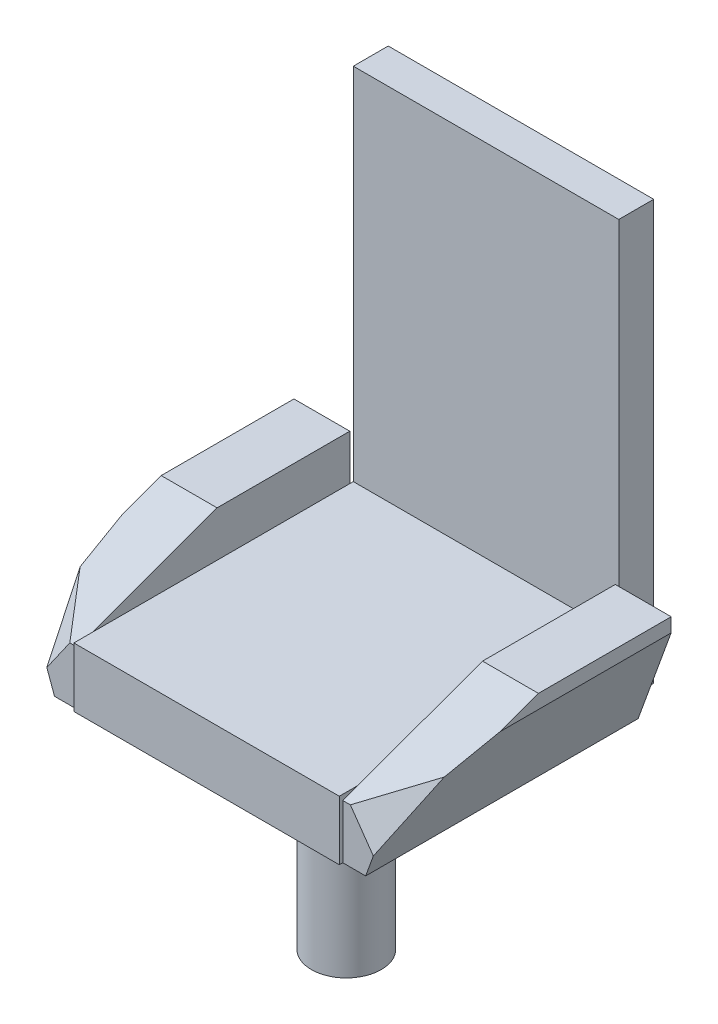
ISO-10303-21;
HEADER;
FILE_DESCRIPTION(('STEP AP214'),'2;1');
FILE_NAME('part.step','',(''),(''),'','','');
FILE_SCHEMA(('AUTOMOTIVE_DESIGN { 1 0 10303 214 1 1 1 1 }'));
ENDSEC;
DATA;
#1=APPLICATION_CONTEXT('core data for automotive mechanical design processes');
#2=APPLICATION_PROTOCOL_DEFINITION('international standard','automotive_design',2000,#1);
#3=PRODUCT_CONTEXT('',#1,'mechanical');
#4=PRODUCT('Part','Part','',(#3));
#5=PRODUCT_RELATED_PRODUCT_CATEGORY('part','',(#4));
#6=PRODUCT_DEFINITION_FORMATION('','',#4);
#7=PRODUCT_DEFINITION_CONTEXT('part definition',#1,'design');
#8=PRODUCT_DEFINITION('design','',#6,#7);
#9=PRODUCT_DEFINITION_SHAPE('','',#8);
#10=(LENGTH_UNIT() NAMED_UNIT(*) SI_UNIT(.MILLI.,.METRE.));
#11=(NAMED_UNIT(*) PLANE_ANGLE_UNIT() SI_UNIT($,.RADIAN.));
#12=(NAMED_UNIT(*) SI_UNIT($,.STERADIAN.) SOLID_ANGLE_UNIT());
#13=UNCERTAINTY_MEASURE_WITH_UNIT(LENGTH_MEASURE(1.E-05),#10,'distance_accuracy_value','');
#14=(GEOMETRIC_REPRESENTATION_CONTEXT(3) GLOBAL_UNCERTAINTY_ASSIGNED_CONTEXT((#13)) GLOBAL_UNIT_ASSIGNED_CONTEXT((#10,
#11,#12)) REPRESENTATION_CONTEXT('',''));
#15=CARTESIAN_POINT('',(0.,0.,0.));
#16=DIRECTION('',(0.,0.,1.));
#17=DIRECTION('',(1.,0.,0.));
#18=AXIS2_PLACEMENT_3D('',#15,#16,#17);
#19=CARTESIAN_POINT('',(0.,150.,195.));
#20=DIRECTION('',(0.,0.,-1.));
#21=DIRECTION('',(-1.,0.,0.));
#22=AXIS2_PLACEMENT_3D('',#19,#20,#21);
#23=PLANE('',#22);
#24=DIRECTION('',(-1.,0.,0.));
#25=VECTOR('',#24,1.);
#26=CARTESIAN_POINT('',(-270.,77.2059531467595,195.));
#27=LINE('',#26,#25);
#28=CARTESIAN_POINT('',(-190.,77.2059531467595,195.));
#29=VERTEX_POINT('',#28);
#30=CARTESIAN_POINT('',(-200.784538398965,77.2059531467595,195.));
#31=VERTEX_POINT('',#30);
#32=EDGE_CURVE('E196',#29,#31,#27,.T.);
#33=ORIENTED_EDGE('',*,*,#32,.T.);
#34=DIRECTION('',(-0.573576436351047,-0.819152044288991,0.));
#35=VECTOR('',#34,1.);
#36=CARTESIAN_POINT('',(-100.526433167311,220.389366293086,195.));
#37=LINE('',#36,#35);
#38=CARTESIAN_POINT('',(-233.683531232682,30.221322107464,195.));
#39=VERTEX_POINT('',#38);
#40=EDGE_CURVE('E194',#31,#39,#37,.T.);
#41=ORIENTED_EDGE('',*,*,#40,.T.);
#42=DIRECTION('',(-0.342020143325666,0.939692620785909,0.));
#43=VECTOR('',#42,1.);
#44=CARTESIAN_POINT('',(-222.683869545394,0.,195.));
#45=LINE('',#44,#43);
#46=CARTESIAN_POINT('',(-222.683869545394,0.,195.));
#47=VERTEX_POINT('',#46);
#48=EDGE_CURVE('E184',#39,#47,#45,.F.);
#49=ORIENTED_EDGE('',*,*,#48,.T.);
#50=DIRECTION('',(1.,0.,0.));
#51=VECTOR('',#50,1.);
#52=CARTESIAN_POINT('',(0.,0.,195.));
#53=LINE('',#52,#51);
#54=CARTESIAN_POINT('',(-190.,0.,195.));
#55=VERTEX_POINT('',#54);
#56=EDGE_CURVE('E295',#47,#55,#53,.T.);
#57=ORIENTED_EDGE('',*,*,#56,.T.);
#58=DIRECTION('',(0.,-1.,0.));
#59=VECTOR('',#58,1.);
#60=CARTESIAN_POINT('',(-190.,150.,195.));
#61=LINE('',#60,#59);
#62=EDGE_CURVE('E254',#29,#55,#61,.T.);
#63=ORIENTED_EDGE('',*,*,#62,.F.);
#64=EDGE_LOOP('',(#33,#41,#49,#57,#63));
#65=FACE_BOUND('',#64,.T.);
#66=ADVANCED_FACE('F37',(#65),#23,.F.);
#67=CARTESIAN_POINT('',(0.,150.,195.));
#68=DIRECTION('',(0.,0.,-1.));
#69=DIRECTION('',(-1.,0.,0.));
#70=AXIS2_PLACEMENT_3D('',#67,#68,#69);
#71=PLANE('',#70);
#72=DIRECTION('',(0.342020143325666,0.939692620785909,0.));
#73=VECTOR('',#72,1.);
#74=CARTESIAN_POINT('',(270.,130.000000000001,195.));
#75=LINE('',#74,#73);
#76=CARTESIAN_POINT('',(222.683869545394,0.,195.));
#77=VERTEX_POINT('',#76);
#78=CARTESIAN_POINT('',(233.683531232682,30.2213221074639,195.));
#79=VERTEX_POINT('',#78);
#80=EDGE_CURVE('E215',#77,#79,#75,.T.);
#81=ORIENTED_EDGE('',*,*,#80,.T.);
#82=DIRECTION('',(-0.573576436351047,0.819152044288991,0.));
#83=VECTOR('',#82,1.);
#84=CARTESIAN_POINT('',(100.526433167311,220.389366293086,195.));
#85=LINE('',#84,#83);
#86=CARTESIAN_POINT('',(200.784538398965,77.2059531467595,195.));
#87=VERTEX_POINT('',#86);
#88=EDGE_CURVE('E190',#79,#87,#85,.T.);
#89=ORIENTED_EDGE('',*,*,#88,.T.);
#90=DIRECTION('',(-1.,0.,0.));
#91=VECTOR('',#90,1.);
#92=CARTESIAN_POINT('',(190.,77.2059531467595,195.));
#93=LINE('',#92,#91);
#94=CARTESIAN_POINT('',(190.,77.2059531467595,195.));
#95=VERTEX_POINT('',#94);
#96=EDGE_CURVE('E233',#87,#95,#93,.T.);
#97=ORIENTED_EDGE('',*,*,#96,.T.);
#98=DIRECTION('',(0.,-1.,0.));
#99=VECTOR('',#98,1.);
#100=CARTESIAN_POINT('',(190.,150.,195.));
#101=LINE('',#100,#99);
#102=CARTESIAN_POINT('',(190.,0.,195.));
#103=VERTEX_POINT('',#102);
#104=EDGE_CURVE('E250',#95,#103,#101,.T.);
#105=ORIENTED_EDGE('',*,*,#104,.T.);
#106=DIRECTION('',(1.,0.,0.));
#107=VECTOR('',#106,1.);
#108=CARTESIAN_POINT('',(0.,0.,195.));
#109=LINE('',#108,#107);
#110=EDGE_CURVE('E315',#103,#77,#109,.T.);
#111=ORIENTED_EDGE('',*,*,#110,.T.);
#112=EDGE_LOOP('',(#81,#89,#97,#105,#111));
#113=FACE_BOUND('',#112,.T.);
#114=ADVANCED_FACE('F383',(#113),#71,.F.);
#115=CARTESIAN_POINT('',(190.,85.,200.));
#116=DIRECTION('',(-1.,0.,0.));
#117=DIRECTION('',(0.,0.,1.));
#118=AXIS2_PLACEMENT_3D('',#115,#116,#117);
#119=PLANE('',#118);
#120=ORIENTED_EDGE('',*,*,#104,.F.);
#121=DIRECTION('',(0.,0.342020143325666,-0.93969262078591));
#122=VECTOR('',#121,1.);
#123=CARTESIAN_POINT('',(190.,76.5107144084965,196.910152734508));
#124=LINE('',#123,#122);
#125=CARTESIAN_POINT('',(190.,85.,173.58603226455));
#126=VERTEX_POINT('',#125);
#127=EDGE_CURVE('E226',#95,#126,#124,.T.);
#128=ORIENTED_EDGE('',*,*,#127,.T.);
#129=DIRECTION('',(0.,0.,-1.));
#130=VECTOR('',#129,1.);
#131=CARTESIAN_POINT('',(190.,85.,200.));
#132=LINE('',#131,#130);
#133=CARTESIAN_POINT('',(190.,85.,200.));
#134=VERTEX_POINT('',#133);
#135=EDGE_CURVE('E279',#134,#126,#132,.T.);
#136=ORIENTED_EDGE('',*,*,#135,.F.);
#137=DIRECTION('',(0.,-1.,0.));
#138=VECTOR('',#137,1.);
#139=CARTESIAN_POINT('',(190.,85.,200.));
#140=LINE('',#139,#138);
#141=CARTESIAN_POINT('',(190.,0.,200.));
#142=VERTEX_POINT('',#141);
#143=EDGE_CURVE('E255',#134,#142,#140,.T.);
#144=ORIENTED_EDGE('',*,*,#143,.T.);
#145=DIRECTION('',(0.,0.,-1.));
#146=VECTOR('',#145,1.);
#147=CARTESIAN_POINT('',(190.,0.,200.));
#148=LINE('',#147,#146);
#149=EDGE_CURVE('E266',#142,#103,#148,.T.);
#150=ORIENTED_EDGE('',*,*,#149,.T.);
#151=EDGE_LOOP('',(#120,#128,#136,#144,#150));
#152=FACE_BOUND('',#151,.T.);
#153=ADVANCED_FACE('F394',(#152),#119,.F.);
#154=CARTESIAN_POINT('',(-190.,85.,200.));
#155=DIRECTION('',(1.,0.,0.));
#156=DIRECTION('',(0.,0.,-1.));
#157=AXIS2_PLACEMENT_3D('',#154,#155,#156);
#158=PLANE('',#157);
#159=DIRECTION('',(0.,-1.,0.));
#160=VECTOR('',#159,1.);
#161=CARTESIAN_POINT('',(-190.,150.,-195.));
#162=LINE('',#161,#160);
#163=CARTESIAN_POINT('',(-190.,85.,-195.));
#164=VERTEX_POINT('',#163);
#165=CARTESIAN_POINT('',(-190.,0.,-195.));
#166=VERTEX_POINT('',#165);
#167=EDGE_CURVE('E284',#164,#166,#162,.T.);
#168=ORIENTED_EDGE('',*,*,#167,.F.);
#169=DIRECTION('',(0.,0.,1.));
#170=VECTOR('',#169,1.);
#171=CARTESIAN_POINT('',(-190.,85.,200.));
#172=LINE('',#171,#170);
#173=CARTESIAN_POINT('',(-190.,85.,-200.));
#174=VERTEX_POINT('',#173);
#175=EDGE_CURVE('E271',#174,#164,#172,.T.);
#176=ORIENTED_EDGE('',*,*,#175,.F.);
#177=DIRECTION('',(0.,1.,0.));
#178=VECTOR('',#177,1.);
#179=CARTESIAN_POINT('',(-190.,0.,-200.));
#180=LINE('',#179,#178);
#181=CARTESIAN_POINT('',(-190.,600.,-200.));
#182=VERTEX_POINT('',#181);
#183=EDGE_CURVE('E337',#174,#182,#180,.T.);
#184=ORIENTED_EDGE('',*,*,#183,.T.);
#185=DIRECTION('',(0.,0.,1.));
#186=VECTOR('',#185,1.);
#187=CARTESIAN_POINT('',(-190.,600.,-250.));
#188=LINE('',#187,#186);
#189=CARTESIAN_POINT('',(-190.,600.,-250.));
#190=VERTEX_POINT('',#189);
#191=EDGE_CURVE('E318',#190,#182,#188,.T.);
#192=ORIENTED_EDGE('',*,*,#191,.F.);
#193=DIRECTION('',(0.,1.,0.));
#194=VECTOR('',#193,1.);
#195=CARTESIAN_POINT('',(-190.,0.,-250.));
#196=LINE('',#195,#194);
#197=CARTESIAN_POINT('',(-190.,0.,-250.));
#198=VERTEX_POINT('',#197);
#199=EDGE_CURVE('E334',#198,#190,#196,.T.);
#200=ORIENTED_EDGE('',*,*,#199,.F.);
#201=DIRECTION('',(0.,0.,1.));
#202=VECTOR('',#201,1.);
#203=CARTESIAN_POINT('',(-190.,0.,200.));
#204=LINE('',#203,#202);
#205=EDGE_CURVE('E262',#198,#166,#204,.T.);
#206=ORIENTED_EDGE('',*,*,#205,.T.);
#207=EDGE_LOOP('',(#168,#176,#184,#192,#200,#206));
#208=FACE_BOUND('',#207,.T.);
#209=ADVANCED_FACE('F431',(#208),#158,.F.);
#210=CARTESIAN_POINT('',(190.,85.,-195.));
#211=VERTEX_POINT('',#210);
#212=CARTESIAN_POINT('',(190.,85.,-200.));
#213=VERTEX_POINT('',#212);
#214=EDGE_CURVE('E261',#211,#213,#132,.T.);
#215=ORIENTED_EDGE('',*,*,#214,.F.);
#216=DIRECTION('',(0.,-1.,0.));
#217=VECTOR('',#216,1.);
#218=CARTESIAN_POINT('',(190.,150.,-195.));
#219=LINE('',#218,#217);
#220=CARTESIAN_POINT('',(190.,0.,-195.));
#221=VERTEX_POINT('',#220);
#222=EDGE_CURVE('E304',#211,#221,#219,.T.);
#223=ORIENTED_EDGE('',*,*,#222,.T.);
#224=CARTESIAN_POINT('',(190.,0.,-250.));
#225=VERTEX_POINT('',#224);
#226=EDGE_CURVE('E269',#221,#225,#148,.T.);
#227=ORIENTED_EDGE('',*,*,#226,.T.);
#228=DIRECTION('',(0.,-1.,0.));
#229=VECTOR('',#228,1.);
#230=CARTESIAN_POINT('',(190.,0.,-250.));
#231=LINE('',#230,#229);
#232=CARTESIAN_POINT('',(190.,600.,-250.));
#233=VERTEX_POINT('',#232);
#234=EDGE_CURVE('E342',#233,#225,#231,.T.);
#235=ORIENTED_EDGE('',*,*,#234,.F.);
#236=DIRECTION('',(0.,0.,1.));
#237=VECTOR('',#236,1.);
#238=CARTESIAN_POINT('',(190.,600.,-250.));
#239=LINE('',#238,#237);
#240=CARTESIAN_POINT('',(190.,600.,-200.));
#241=VERTEX_POINT('',#240);
#242=EDGE_CURVE('E327',#233,#241,#239,.T.);
#243=ORIENTED_EDGE('',*,*,#242,.T.);
#244=DIRECTION('',(0.,-1.,0.));
#245=VECTOR('',#244,1.);
#246=CARTESIAN_POINT('',(190.,0.,-200.));
#247=LINE('',#246,#245);
#248=EDGE_CURVE('E331',#241,#213,#247,.T.);
#249=ORIENTED_EDGE('',*,*,#248,.T.);
#250=EDGE_LOOP('',(#215,#223,#227,#235,#243,#249));
#251=FACE_BOUND('',#250,.T.);
#252=ADVANCED_FACE('F439',(#251),#119,.F.);
#253=CARTESIAN_POINT('',(-190.,85.,173.58603226455));
#254=VERTEX_POINT('',#253);
#255=CARTESIAN_POINT('',(-190.,85.,200.));
#256=VERTEX_POINT('',#255);
#257=EDGE_CURVE('E275',#254,#256,#172,.T.);
#258=ORIENTED_EDGE('',*,*,#257,.F.);
#259=DIRECTION('',(0.,-0.342020143325666,0.93969262078591));
#260=VECTOR('',#259,1.);
#261=CARTESIAN_POINT('',(-190.,76.5107144084965,196.910152734508));
#262=LINE('',#261,#260);
#263=EDGE_CURVE('E229',#254,#29,#262,.T.);
#264=ORIENTED_EDGE('',*,*,#263,.T.);
#265=ORIENTED_EDGE('',*,*,#62,.T.);
#266=CARTESIAN_POINT('',(-190.,0.,200.));
#267=VERTEX_POINT('',#266);
#268=EDGE_CURVE('E265',#55,#267,#204,.T.);
#269=ORIENTED_EDGE('',*,*,#268,.T.);
#270=DIRECTION('',(0.,-1.,0.));
#271=VECTOR('',#270,1.);
#272=CARTESIAN_POINT('',(-190.,85.,200.));
#273=LINE('',#272,#271);
#274=EDGE_CURVE('E251',#256,#267,#273,.T.);
#275=ORIENTED_EDGE('',*,*,#274,.F.);
#276=EDGE_LOOP('',(#258,#264,#265,#269,#275));
#277=FACE_BOUND('',#276,.T.);
#278=ADVANCED_FACE('F406',(#277),#158,.F.);
#279=CARTESIAN_POINT('',(-190.,85.,200.));
#280=DIRECTION('',(0.,0.,-1.));
#281=DIRECTION('',(-1.,0.,0.));
#282=AXIS2_PLACEMENT_3D('',#279,#280,#281);
#283=PLANE('',#282);
#284=DIRECTION('',(1.,0.,0.));
#285=VECTOR('',#284,1.);
#286=CARTESIAN_POINT('',(-190.,0.,200.));
#287=LINE('',#286,#285);
#288=EDGE_CURVE('E259',#267,#142,#287,.T.);
#289=ORIENTED_EDGE('',*,*,#288,.T.);
#290=ORIENTED_EDGE('',*,*,#143,.F.);
#291=DIRECTION('',(1.,0.,0.));
#292=VECTOR('',#291,1.);
#293=CARTESIAN_POINT('',(-190.,85.,200.));
#294=LINE('',#293,#292);
#295=EDGE_CURVE('E258',#256,#134,#294,.T.);
#296=ORIENTED_EDGE('',*,*,#295,.F.);
#297=ORIENTED_EDGE('',*,*,#274,.T.);
#298=EDGE_LOOP('',(#289,#290,#296,#297));
#299=FACE_BOUND('',#298,.T.);
#300=ADVANCED_FACE('F402',(#299),#283,.F.);
#301=CARTESIAN_POINT('',(0.,85.,0.));
#302=DIRECTION('',(0.,-1.,0.));
#303=DIRECTION('',(0.,0.,-1.));
#304=AXIS2_PLACEMENT_3D('',#301,#302,#303);
#305=PLANE('',#304);
#306=ORIENTED_EDGE('',*,*,#135,.T.);
#307=EDGE_CURVE('E281',#126,#211,#132,.T.);
#308=ORIENTED_EDGE('',*,*,#307,.T.);
#309=ORIENTED_EDGE('',*,*,#214,.T.);
#310=DIRECTION('',(-1.,0.,0.));
#311=VECTOR('',#310,1.);
#312=CARTESIAN_POINT('',(-190.,85.,-200.));
#313=LINE('',#312,#311);
#314=EDGE_CURVE('E276',#213,#174,#313,.T.);
#315=ORIENTED_EDGE('',*,*,#314,.T.);
#316=ORIENTED_EDGE('',*,*,#175,.T.);
#317=EDGE_CURVE('E274',#164,#254,#172,.T.);
#318=ORIENTED_EDGE('',*,*,#317,.T.);
#319=ORIENTED_EDGE('',*,*,#257,.T.);
#320=ORIENTED_EDGE('',*,*,#295,.T.);
#321=EDGE_LOOP('',(#306,#308,#309,#315,#316,#318,#319,#320));
#322=FACE_BOUND('',#321,.T.);
#323=ADVANCED_FACE('F368',(#322),#305,.F.);
#324=CARTESIAN_POINT('',(0.,0.,0.));
#325=DIRECTION('',(0.,-1.,0.));
#326=DIRECTION('',(0.,0.,-1.));
#327=AXIS2_PLACEMENT_3D('',#324,#325,#326);
#328=PLANE('',#327);
#329=CARTESIAN_POINT('',(0.,0.,0.));
#330=DIRECTION('',(0.,-1.,0.));
#331=DIRECTION('',(0.,0.,-1.));
#332=AXIS2_PLACEMENT_3D('',#329,#330,#331);
#333=CIRCLE('',#332,50.);
#334=CARTESIAN_POINT('',(0.,0.,-50.));
#335=VERTEX_POINT('',#334);
#336=EDGE_CURVE('E349',#335,#335,#333,.T.);
#337=ORIENTED_EDGE('',*,*,#336,.F.);
#338=EDGE_LOOP('',(#337));
#339=FACE_BOUND('',#338,.T.);
#340=DIRECTION('',(1.,0.,0.));
#341=VECTOR('',#340,1.);
#342=CARTESIAN_POINT('',(0.,0.,-195.));
#343=LINE('',#342,#341);
#344=CARTESIAN_POINT('',(222.683869545394,0.,-195.));
#345=VERTEX_POINT('',#344);
#346=EDGE_CURVE('E311',#221,#345,#343,.T.);
#347=ORIENTED_EDGE('',*,*,#346,.T.);
#348=DIRECTION('',(0.,0.,1.));
#349=VECTOR('',#348,1.);
#350=CARTESIAN_POINT('',(222.683869545394,0.,195.));
#351=LINE('',#350,#349);
#352=EDGE_CURVE('E218',#345,#77,#351,.T.);
#353=ORIENTED_EDGE('',*,*,#352,.T.);
#354=ORIENTED_EDGE('',*,*,#110,.F.);
#355=ORIENTED_EDGE('',*,*,#149,.F.);
#356=ORIENTED_EDGE('',*,*,#288,.F.);
#357=ORIENTED_EDGE('',*,*,#268,.F.);
#358=ORIENTED_EDGE('',*,*,#56,.F.);
#359=DIRECTION('',(0.,0.,-1.));
#360=VECTOR('',#359,1.);
#361=CARTESIAN_POINT('',(-222.683869545394,0.,0.));
#362=LINE('',#361,#360);
#363=CARTESIAN_POINT('',(-222.683869545394,0.,-195.));
#364=VERTEX_POINT('',#363);
#365=EDGE_CURVE('E187',#47,#364,#362,.T.);
#366=ORIENTED_EDGE('',*,*,#365,.T.);
#367=DIRECTION('',(1.,0.,0.));
#368=VECTOR('',#367,1.);
#369=CARTESIAN_POINT('',(0.,0.,-195.));
#370=LINE('',#369,#368);
#371=EDGE_CURVE('E292',#364,#166,#370,.T.);
#372=ORIENTED_EDGE('',*,*,#371,.T.);
#373=ORIENTED_EDGE('',*,*,#205,.F.);
#374=DIRECTION('',(-1.,0.,0.));
#375=VECTOR('',#374,1.);
#376=CARTESIAN_POINT('',(-190.,0.,-250.));
#377=LINE('',#376,#375);
#378=EDGE_CURVE('E330',#225,#198,#377,.T.);
#379=ORIENTED_EDGE('',*,*,#378,.F.);
#380=ORIENTED_EDGE('',*,*,#226,.F.);
#381=EDGE_LOOP('',(#347,#353,#354,#355,#356,#357,#358,#366,#372,#373,#379,#380));
#382=FACE_BOUND('',#381,.T.);
#383=ADVANCED_FACE('F364',(#339,#382),#328,.T.);
#384=CARTESIAN_POINT('',(-190.,150.,0.));
#385=DIRECTION('',(-1.,0.,0.));
#386=DIRECTION('',(0.,0.,1.));
#387=AXIS2_PLACEMENT_3D('',#384,#385,#386);
#388=PLANE('',#387);
#389=DIRECTION('',(0.,0.,-1.));
#390=VECTOR('',#389,1.);
#391=CARTESIAN_POINT('',(-190.,150.,0.));
#392=LINE('',#391,#390);
#393=CARTESIAN_POINT('',(-190.,150.,-5.00000000000195));
#394=VERTEX_POINT('',#393);
#395=CARTESIAN_POINT('',(-190.,150.,-195.));
#396=VERTEX_POINT('',#395);
#397=EDGE_CURVE('E294',#394,#396,#392,.T.);
#398=ORIENTED_EDGE('',*,*,#397,.F.);
#399=DIRECTION('',(0.,-0.342020143325666,0.93969262078591));
#400=VECTOR('',#399,1.);
#401=CARTESIAN_POINT('',(-190.,150.,-5.00000000000195));
#402=LINE('',#401,#400);
#403=EDGE_CURVE('E244',#394,#254,#402,.T.);
#404=ORIENTED_EDGE('',*,*,#403,.T.);
#405=ORIENTED_EDGE('',*,*,#317,.F.);
#406=EDGE_CURVE('E285',#396,#164,#162,.T.);
#407=ORIENTED_EDGE('',*,*,#406,.F.);
#408=EDGE_LOOP('',(#398,#404,#405,#407));
#409=FACE_BOUND('',#408,.T.);
#410=ADVANCED_FACE('F367',(#409),#388,.F.);
#411=CARTESIAN_POINT('',(0.,150.,-195.));
#412=DIRECTION('',(0.,0.,-1.));
#413=DIRECTION('',(-1.,0.,0.));
#414=AXIS2_PLACEMENT_3D('',#411,#412,#413);
#415=PLANE('',#414);
#416=ORIENTED_EDGE('',*,*,#371,.F.);
#417=DIRECTION('',(0.342020143325666,-0.939692620785909,0.));
#418=VECTOR('',#417,1.);
#419=CARTESIAN_POINT('',(-244.843875917927,60.8841171235077,-195.));
#420=LINE('',#419,#418);
#421=CARTESIAN_POINT('',(-270.,130.000000000001,-195.));
#422=VERTEX_POINT('',#421);
#423=EDGE_CURVE('E211',#364,#422,#420,.F.);
#424=ORIENTED_EDGE('',*,*,#423,.T.);
#425=DIRECTION('',(0.,-1.,0.));
#426=VECTOR('',#425,1.);
#427=CARTESIAN_POINT('',(-270.,150.,-195.));
#428=LINE('',#427,#426);
#429=CARTESIAN_POINT('',(-270.,150.,-195.));
#430=VERTEX_POINT('',#429);
#431=EDGE_CURVE('E288',#430,#422,#428,.T.);
#432=ORIENTED_EDGE('',*,*,#431,.F.);
#433=DIRECTION('',(1.,0.,0.));
#434=VECTOR('',#433,1.);
#435=CARTESIAN_POINT('',(0.,150.,-195.));
#436=LINE('',#435,#434);
#437=EDGE_CURVE('E299',#430,#396,#436,.T.);
#438=ORIENTED_EDGE('',*,*,#437,.T.);
#439=ORIENTED_EDGE('',*,*,#406,.T.);
#440=ORIENTED_EDGE('',*,*,#167,.T.);
#441=EDGE_LOOP('',(#416,#424,#432,#438,#439,#440));
#442=FACE_BOUND('',#441,.T.);
#443=ADVANCED_FACE('F424',(#442),#415,.T.);
#444=CARTESIAN_POINT('',(-270.,150.,0.));
#445=DIRECTION('',(-1.,0.,0.));
#446=DIRECTION('',(0.,0.,1.));
#447=AXIS2_PLACEMENT_3D('',#444,#445,#446);
#448=PLANE('',#447);
#449=ORIENTED_EDGE('',*,*,#431,.T.);
#450=DIRECTION('',(0.,0.,1.));
#451=VECTOR('',#450,1.);
#452=CARTESIAN_POINT('',(-270.,130.000000000001,0.));
#453=LINE('',#452,#451);
#454=CARTESIAN_POINT('',(-270.,130.000000000001,49.9495483890879));
#455=VERTEX_POINT('',#454);
#456=EDGE_CURVE('E209',#422,#455,#453,.T.);
#457=ORIENTED_EDGE('',*,*,#456,.T.);
#458=DIRECTION('',(0.,0.342020143325666,-0.93969262078591));
#459=VECTOR('',#458,1.);
#460=CARTESIAN_POINT('',(-270.,148.393030975783,-0.584888892202773));
#461=LINE('',#460,#459);
#462=CARTESIAN_POINT('',(-270.,150.,-5.00000000000195));
#463=VERTEX_POINT('',#462);
#464=EDGE_CURVE('E241',#455,#463,#461,.T.);
#465=ORIENTED_EDGE('',*,*,#464,.T.);
#466=DIRECTION('',(0.,0.,-1.));
#467=VECTOR('',#466,1.);
#468=CARTESIAN_POINT('',(-270.,150.,0.));
#469=LINE('',#468,#467);
#470=EDGE_CURVE('E291',#463,#430,#469,.T.);
#471=ORIENTED_EDGE('',*,*,#470,.T.);
#472=EDGE_LOOP('',(#449,#457,#465,#471));
#473=FACE_BOUND('',#472,.T.);
#474=ADVANCED_FACE('F427',(#473),#448,.T.);
#475=CARTESIAN_POINT('',(0.,150.,0.));
#476=DIRECTION('',(0.,1.,0.));
#477=DIRECTION('',(0.,0.,1.));
#478=AXIS2_PLACEMENT_3D('',#475,#476,#477);
#479=PLANE('',#478);
#480=ORIENTED_EDGE('',*,*,#470,.F.);
#481=DIRECTION('',(1.,0.,0.));
#482=VECTOR('',#481,1.);
#483=CARTESIAN_POINT('',(-190.,150.,-5.00000000000195));
#484=LINE('',#483,#482);
#485=EDGE_CURVE('E247',#463,#394,#484,.T.);
#486=ORIENTED_EDGE('',*,*,#485,.T.);
#487=ORIENTED_EDGE('',*,*,#397,.T.);
#488=ORIENTED_EDGE('',*,*,#437,.F.);
#489=EDGE_LOOP('',(#480,#486,#487,#488));
#490=FACE_BOUND('',#489,.T.);
#491=ADVANCED_FACE('F416',(#490),#479,.T.);
#492=CARTESIAN_POINT('',(190.,150.,0.));
#493=DIRECTION('',(1.,0.,0.));
#494=DIRECTION('',(0.,0.,-1.));
#495=AXIS2_PLACEMENT_3D('',#492,#493,#494);
#496=PLANE('',#495);
#497=ORIENTED_EDGE('',*,*,#307,.F.);
#498=DIRECTION('',(0.,0.342020143325666,-0.93969262078591));
#499=VECTOR('',#498,1.);
#500=CARTESIAN_POINT('',(190.,150.,-5.00000000000195));
#501=LINE('',#500,#499);
#502=CARTESIAN_POINT('',(190.,150.,-5.00000000000195));
#503=VERTEX_POINT('',#502);
#504=EDGE_CURVE('E231',#126,#503,#501,.T.);
#505=ORIENTED_EDGE('',*,*,#504,.T.);
#506=DIRECTION('',(0.,0.,1.));
#507=VECTOR('',#506,1.);
#508=CARTESIAN_POINT('',(190.,150.,0.));
#509=LINE('',#508,#507);
#510=CARTESIAN_POINT('',(190.,150.,-195.));
#511=VERTEX_POINT('',#510);
#512=EDGE_CURVE('E314',#511,#503,#509,.T.);
#513=ORIENTED_EDGE('',*,*,#512,.F.);
#514=EDGE_CURVE('E307',#511,#211,#219,.T.);
#515=ORIENTED_EDGE('',*,*,#514,.T.);
#516=EDGE_LOOP('',(#497,#505,#513,#515));
#517=FACE_BOUND('',#516,.T.);
#518=ADVANCED_FACE('F445',(#517),#496,.F.);
#519=CARTESIAN_POINT('',(270.,150.,0.));
#520=DIRECTION('',(-1.,0.,0.));
#521=DIRECTION('',(0.,0.,1.));
#522=AXIS2_PLACEMENT_3D('',#519,#520,#521);
#523=PLANE('',#522);
#524=DIRECTION('',(0.,-0.342020143325666,0.93969262078591));
#525=VECTOR('',#524,1.);
#526=CARTESIAN_POINT('',(270.,150.,-5.00000000000195));
#527=LINE('',#526,#525);
#528=CARTESIAN_POINT('',(270.,150.,-5.00000000000195));
#529=VERTEX_POINT('',#528);
#530=CARTESIAN_POINT('',(270.,130.000000000001,49.9495483890879));
#531=VERTEX_POINT('',#530);
#532=EDGE_CURVE('E235',#529,#531,#527,.T.);
#533=ORIENTED_EDGE('',*,*,#532,.T.);
#534=DIRECTION('',(0.,0.,-1.));
#535=VECTOR('',#534,1.);
#536=CARTESIAN_POINT('',(270.,130.000000000001,-195.));
#537=LINE('',#536,#535);
#538=CARTESIAN_POINT('',(270.,130.000000000001,-195.));
#539=VERTEX_POINT('',#538);
#540=EDGE_CURVE('E223',#531,#539,#537,.T.);
#541=ORIENTED_EDGE('',*,*,#540,.T.);
#542=DIRECTION('',(0.,-1.,0.));
#543=VECTOR('',#542,1.);
#544=CARTESIAN_POINT('',(270.,150.,-195.));
#545=LINE('',#544,#543);
#546=CARTESIAN_POINT('',(270.,150.,-195.));
#547=VERTEX_POINT('',#546);
#548=EDGE_CURVE('E297',#547,#539,#545,.T.);
#549=ORIENTED_EDGE('',*,*,#548,.F.);
#550=DIRECTION('',(0.,0.,-1.));
#551=VECTOR('',#550,1.);
#552=CARTESIAN_POINT('',(270.,150.,0.));
#553=LINE('',#552,#551);
#554=EDGE_CURVE('E321',#529,#547,#553,.T.);
#555=ORIENTED_EDGE('',*,*,#554,.F.);
#556=EDGE_LOOP('',(#533,#541,#549,#555));
#557=FACE_BOUND('',#556,.T.);
#558=ADVANCED_FACE('F453',(#557),#523,.F.);
#559=CARTESIAN_POINT('',(0.,150.,-195.));
#560=DIRECTION('',(0.,0.,-1.));
#561=DIRECTION('',(-1.,0.,0.));
#562=AXIS2_PLACEMENT_3D('',#559,#560,#561);
#563=PLANE('',#562);
#564=ORIENTED_EDGE('',*,*,#548,.T.);
#565=DIRECTION('',(-0.342020143325666,-0.939692620785909,0.));
#566=VECTOR('',#565,1.);
#567=CARTESIAN_POINT('',(244.843875917928,60.8841171235077,-195.));
#568=LINE('',#567,#566);
#569=EDGE_CURVE('E221',#539,#345,#568,.T.);
#570=ORIENTED_EDGE('',*,*,#569,.T.);
#571=ORIENTED_EDGE('',*,*,#346,.F.);
#572=ORIENTED_EDGE('',*,*,#222,.F.);
#573=ORIENTED_EDGE('',*,*,#514,.F.);
#574=DIRECTION('',(1.,0.,0.));
#575=VECTOR('',#574,1.);
#576=CARTESIAN_POINT('',(0.,150.,-195.));
#577=LINE('',#576,#575);
#578=EDGE_CURVE('E310',#511,#547,#577,.T.);
#579=ORIENTED_EDGE('',*,*,#578,.T.);
#580=EDGE_LOOP('',(#564,#570,#571,#572,#573,#579));
#581=FACE_BOUND('',#580,.T.);
#582=ADVANCED_FACE('F442',(#581),#563,.T.);
#583=CARTESIAN_POINT('',(0.,150.,0.));
#584=DIRECTION('',(0.,1.,0.));
#585=DIRECTION('',(0.,0.,1.));
#586=AXIS2_PLACEMENT_3D('',#583,#584,#585);
#587=PLANE('',#586);
#588=ORIENTED_EDGE('',*,*,#512,.T.);
#589=DIRECTION('',(1.,0.,0.));
#590=VECTOR('',#589,1.);
#591=CARTESIAN_POINT('',(270.,150.,-5.00000000000195));
#592=LINE('',#591,#590);
#593=EDGE_CURVE('E238',#503,#529,#592,.T.);
#594=ORIENTED_EDGE('',*,*,#593,.T.);
#595=ORIENTED_EDGE('',*,*,#554,.T.);
#596=ORIENTED_EDGE('',*,*,#578,.F.);
#597=EDGE_LOOP('',(#588,#594,#595,#596));
#598=FACE_BOUND('',#597,.T.);
#599=ADVANCED_FACE('F449',(#598),#587,.T.);
#600=CARTESIAN_POINT('',(0.,150.,-5.00000000000195));
#601=DIRECTION('',(0.,0.93969262078591,0.342020143325666));
#602=DIRECTION('',(-1.,0.,0.));
#603=AXIS2_PLACEMENT_3D('',#600,#601,#602);
#604=PLANE('',#603);
#605=DIRECTION('',(-0.60219947926198,0.273050295843313,-0.750199522204913));
#606=VECTOR('',#605,1.);
#607=CARTESIAN_POINT('',(-230.294719273234,90.5865087526592,158.237225613033));
#608=LINE('',#607,#606);
#609=CARTESIAN_POINT('',(-260.667072305315,104.357991901451,120.400386629329));
#610=VERTEX_POINT('',#609);
#611=EDGE_CURVE('E46',#31,#610,#608,.T.);
#612=ORIENTED_EDGE('',*,*,#611,.F.);
#613=ORIENTED_EDGE('',*,*,#32,.F.);
#614=ORIENTED_EDGE('',*,*,#263,.F.);
#615=ORIENTED_EDGE('',*,*,#403,.F.);
#616=ORIENTED_EDGE('',*,*,#485,.F.);
#617=ORIENTED_EDGE('',*,*,#464,.F.);
#618=DIRECTION('',(-0.123531673829373,0.339400484433638,-0.932495167133388));
#619=VECTOR('',#618,1.);
#620=CARTESIAN_POINT('',(-273.0481003294,138.37458682726,26.9405601839325));
#621=LINE('',#620,#619);
#622=EDGE_CURVE('E191',#455,#610,#621,.F.);
#623=ORIENTED_EDGE('',*,*,#622,.T.);
#624=EDGE_LOOP('',(#612,#613,#614,#615,#616,#617,#623));
#625=FACE_BOUND('',#624,.T.);
#626=ADVANCED_FACE('F408',(#625),#604,.T.);
#627=CARTESIAN_POINT('',(0.,150.,-5.00000000000195));
#628=DIRECTION('',(0.,0.93969262078591,0.342020143325666));
#629=DIRECTION('',(-1.,0.,0.));
#630=AXIS2_PLACEMENT_3D('',#627,#628,#629);
#631=PLANE('',#630);
#632=DIRECTION('',(-0.60219947926198,-0.273050295843313,0.750199522204913));
#633=VECTOR('',#632,1.);
#634=CARTESIAN_POINT('',(230.294719273234,90.5865087526592,158.237225613033));
#635=LINE('',#634,#633);
#636=CARTESIAN_POINT('',(260.667072305315,104.357991901451,120.400386629329));
#637=VERTEX_POINT('',#636);
#638=EDGE_CURVE('E204',#637,#87,#635,.T.);
#639=ORIENTED_EDGE('',*,*,#638,.F.);
#640=DIRECTION('',(0.123531673829373,0.339400484433638,-0.932495167133388));
#641=VECTOR('',#640,1.);
#642=CARTESIAN_POINT('',(273.0481003294,138.37458682726,26.9405601839325));
#643=LINE('',#642,#641);
#644=EDGE_CURVE('E213',#637,#531,#643,.T.);
#645=ORIENTED_EDGE('',*,*,#644,.T.);
#646=ORIENTED_EDGE('',*,*,#532,.F.);
#647=ORIENTED_EDGE('',*,*,#593,.F.);
#648=ORIENTED_EDGE('',*,*,#504,.F.);
#649=ORIENTED_EDGE('',*,*,#127,.F.);
#650=ORIENTED_EDGE('',*,*,#96,.F.);
#651=EDGE_LOOP('',(#639,#645,#646,#647,#648,#649,#650));
#652=FACE_BOUND('',#651,.T.);
#653=ADVANCED_FACE('F389',(#652),#631,.T.);
#654=CARTESIAN_POINT('',(270.,130.000000000001,0.));
#655=DIRECTION('',(0.939692620785909,-0.342020143325666,0.));
#656=DIRECTION('',(0.,0.,1.));
#657=AXIS2_PLACEMENT_3D('',#654,#655,#656);
#658=PLANE('',#657);
#659=DIRECTION('',(0.248514648176915,0.682788384269788,-0.687052030015017));
#660=VECTOR('',#659,1.);
#661=CARTESIAN_POINT('',(286.151942453361,174.377097170941,49.9440497561014));
#662=LINE('',#661,#660);
#663=EDGE_CURVE('E198',#79,#637,#662,.T.);
#664=ORIENTED_EDGE('',*,*,#663,.F.);
#665=ORIENTED_EDGE('',*,*,#80,.F.);
#666=ORIENTED_EDGE('',*,*,#352,.F.);
#667=ORIENTED_EDGE('',*,*,#569,.F.);
#668=ORIENTED_EDGE('',*,*,#540,.F.);
#669=ORIENTED_EDGE('',*,*,#644,.F.);
#670=EDGE_LOOP('',(#664,#665,#666,#667,#668,#669));
#671=FACE_BOUND('',#670,.T.);
#672=ADVANCED_FACE('F379',(#671),#658,.T.);
#673=CARTESIAN_POINT('',(-222.683869545394,0.,0.));
#674=DIRECTION('',(0.939692620785909,0.342020143325666,0.));
#675=DIRECTION('',(0.,0.,-1.));
#676=AXIS2_PLACEMENT_3D('',#673,#674,#675);
#677=PLANE('',#676);
#678=DIRECTION('',(-0.248514648176915,0.682788384269789,-0.687052030015017));
#679=VECTOR('',#678,1.);
#680=CARTESIAN_POINT('',(-261.170941495611,105.742361124149,119.007372766384));
#681=LINE('',#680,#679);
#682=EDGE_CURVE('E11',#610,#39,#681,.F.);
#683=ORIENTED_EDGE('',*,*,#682,.F.);
#684=ORIENTED_EDGE('',*,*,#622,.F.);
#685=ORIENTED_EDGE('',*,*,#456,.F.);
#686=ORIENTED_EDGE('',*,*,#423,.F.);
#687=ORIENTED_EDGE('',*,*,#365,.F.);
#688=ORIENTED_EDGE('',*,*,#48,.F.);
#689=EDGE_LOOP('',(#683,#684,#685,#686,#687,#688));
#690=FACE_BOUND('',#689,.T.);
#691=ADVANCED_FACE('F40',(#690),#677,.F.);
#692=CARTESIAN_POINT('',(-190.,600.,-250.));
#693=DIRECTION('',(0.,-1.,0.));
#694=DIRECTION('',(0.,0.,-1.));
#695=AXIS2_PLACEMENT_3D('',#692,#693,#694);
#696=PLANE('',#695);
#697=DIRECTION('',(1.,0.,0.));
#698=VECTOR('',#697,1.);
#699=CARTESIAN_POINT('',(-190.,600.,-200.));
#700=LINE('',#699,#698);
#701=EDGE_CURVE('E335',#182,#241,#700,.T.);
#702=ORIENTED_EDGE('',*,*,#701,.T.);
#703=ORIENTED_EDGE('',*,*,#242,.F.);
#704=DIRECTION('',(1.,0.,0.));
#705=VECTOR('',#704,1.);
#706=CARTESIAN_POINT('',(-190.,600.,-250.));
#707=LINE('',#706,#705);
#708=EDGE_CURVE('E345',#190,#233,#707,.T.);
#709=ORIENTED_EDGE('',*,*,#708,.F.);
#710=ORIENTED_EDGE('',*,*,#191,.T.);
#711=EDGE_LOOP('',(#702,#703,#709,#710));
#712=FACE_BOUND('',#711,.T.);
#713=ADVANCED_FACE('F498',(#712),#696,.F.);
#714=CARTESIAN_POINT('',(0.,0.,-250.));
#715=DIRECTION('',(0.,0.,-1.));
#716=DIRECTION('',(-1.,0.,0.));
#717=AXIS2_PLACEMENT_3D('',#714,#715,#716);
#718=PLANE('',#717);
#719=ORIENTED_EDGE('',*,*,#199,.T.);
#720=ORIENTED_EDGE('',*,*,#708,.T.);
#721=ORIENTED_EDGE('',*,*,#234,.T.);
#722=ORIENTED_EDGE('',*,*,#378,.T.);
#723=EDGE_LOOP('',(#719,#720,#721,#722));
#724=FACE_BOUND('',#723,.T.);
#725=ADVANCED_FACE('F434',(#724),#718,.T.);
#726=CARTESIAN_POINT('',(0.,0.,-200.));
#727=DIRECTION('',(0.,0.,-1.));
#728=DIRECTION('',(-1.,0.,0.));
#729=AXIS2_PLACEMENT_3D('',#726,#727,#728);
#730=PLANE('',#729);
#731=ORIENTED_EDGE('',*,*,#314,.F.);
#732=ORIENTED_EDGE('',*,*,#248,.F.);
#733=ORIENTED_EDGE('',*,*,#701,.F.);
#734=ORIENTED_EDGE('',*,*,#183,.F.);
#735=EDGE_LOOP('',(#731,#732,#733,#734));
#736=FACE_BOUND('',#735,.T.);
#737=ADVANCED_FACE('F360',(#736),#730,.F.);
#738=CARTESIAN_POINT('',(0.,-300.,0.));
#739=DIRECTION('',(0.,1.,0.));
#740=DIRECTION('',(0.,0.,1.));
#741=AXIS2_PLACEMENT_3D('',#738,#739,#740);
#742=CYLINDRICAL_SURFACE('',#741,50.);
#743=CARTESIAN_POINT('',(0.,-300.,0.));
#744=DIRECTION('',(0.,-1.,0.));
#745=DIRECTION('',(0.,0.,-1.));
#746=AXIS2_PLACEMENT_3D('',#743,#744,#745);
#747=CIRCLE('',#746,50.);
#748=CARTESIAN_POINT('',(0.,-300.,-50.));
#749=VERTEX_POINT('',#748);
#750=EDGE_CURVE('E339',#749,#749,#747,.T.);
#751=ORIENTED_EDGE('',*,*,#750,.F.);
#752=EDGE_LOOP('',(#751));
#753=FACE_BOUND('',#752,.T.);
#754=ORIENTED_EDGE('',*,*,#336,.T.);
#755=EDGE_LOOP('',(#754));
#756=FACE_BOUND('',#755,.T.);
#757=ADVANCED_FACE('F357',(#753,#756),#742,.T.);
#758=CARTESIAN_POINT('',(0.,-300.,0.));
#759=DIRECTION('',(0.,-1.,0.));
#760=DIRECTION('',(0.,0.,-1.));
#761=AXIS2_PLACEMENT_3D('',#758,#759,#760);
#762=PLANE('',#761);
#763=ORIENTED_EDGE('',*,*,#750,.T.);
#764=EDGE_LOOP('',(#763));
#765=FACE_BOUND('',#764,.T.);
#766=ADVANCED_FACE('F355',(#765),#762,.T.);
#767=CARTESIAN_POINT('',(176.740240143326,123.754848453352,186.915846265867));
#768=DIRECTION('',(-0.619132390928651,-0.433521167278043,-0.6547781914701));
#769=DIRECTION('',(-0.72660822184465,0.,0.687052030015017));
#770=AXIS2_PLACEMENT_3D('',#767,#768,#769);
#771=PLANE('',#770);
#772=ORIENTED_EDGE('',*,*,#88,.F.);
#773=ORIENTED_EDGE('',*,*,#663,.T.);
#774=ORIENTED_EDGE('',*,*,#638,.T.);
#775=EDGE_LOOP('',(#772,#773,#774));
#776=FACE_BOUND('',#775,.T.);
#777=ADVANCED_FACE('F386',(#776),#771,.F.);
#778=CARTESIAN_POINT('',(-176.740240143326,123.754848453352,186.915846265867));
#779=DIRECTION('',(0.619132390928651,-0.433521167278043,-0.6547781914701));
#780=DIRECTION('',(-0.72660822184465,0.,-0.687052030015017));
#781=AXIS2_PLACEMENT_3D('',#778,#779,#780);
#782=PLANE('',#781);
#783=ORIENTED_EDGE('',*,*,#40,.F.);
#784=ORIENTED_EDGE('',*,*,#611,.T.);
#785=ORIENTED_EDGE('',*,*,#682,.T.);
#786=EDGE_LOOP('',(#783,#784,#785));
#787=FACE_BOUND('',#786,.T.);
#788=ADVANCED_FACE('F200',(#787),#782,.F.);
#789=CLOSED_SHELL('',(#66,#114,#153,#209,#252,#278,#300,#323,#383,#410,#443,#474,#491,#518,#558,
#582,#599,#626,#653,#672,#691,#713,#725,#737,#757,#766,#777,#788));
#790=MANIFOLD_SOLID_BREP('B2',#789);
#791=ADVANCED_BREP_SHAPE_REPRESENTATION('',(#18,#790),#14);
#792=SHAPE_DEFINITION_REPRESENTATION(#9,#791);
ENDSEC;
END-ISO-10303-21;
